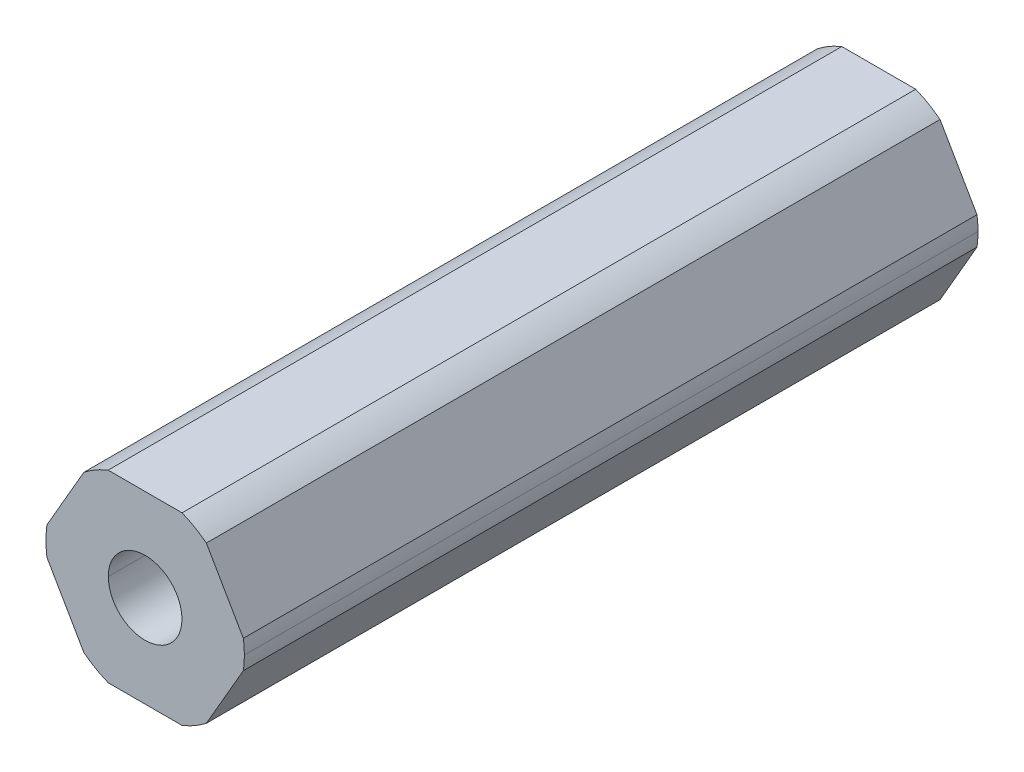
ISO-10303-21;
HEADER;
FILE_DESCRIPTION(('STEP AP214'),'2;1');
FILE_NAME('part.step','',(''),(''),'','','');
FILE_SCHEMA(('AUTOMOTIVE_DESIGN { 1 0 10303 214 1 1 1 1 }'));
ENDSEC;
DATA;
#1=APPLICATION_CONTEXT('core data for automotive mechanical design processes');
#2=APPLICATION_PROTOCOL_DEFINITION('international standard','automotive_design',2000,#1);
#3=PRODUCT_CONTEXT('',#1,'mechanical');
#4=PRODUCT('Part','Part','',(#3));
#5=PRODUCT_RELATED_PRODUCT_CATEGORY('part','',(#4));
#6=PRODUCT_DEFINITION_FORMATION('','',#4);
#7=PRODUCT_DEFINITION_CONTEXT('part definition',#1,'design');
#8=PRODUCT_DEFINITION('design','',#6,#7);
#9=PRODUCT_DEFINITION_SHAPE('','',#8);
#10=(LENGTH_UNIT() NAMED_UNIT(*) SI_UNIT(.MILLI.,.METRE.));
#11=(NAMED_UNIT(*) PLANE_ANGLE_UNIT() SI_UNIT($,.RADIAN.));
#12=(NAMED_UNIT(*) SI_UNIT($,.STERADIAN.) SOLID_ANGLE_UNIT());
#13=UNCERTAINTY_MEASURE_WITH_UNIT(LENGTH_MEASURE(1.E-05),#10,'distance_accuracy_value','');
#14=(GEOMETRIC_REPRESENTATION_CONTEXT(3) GLOBAL_UNCERTAINTY_ASSIGNED_CONTEXT((#13)) GLOBAL_UNIT_ASSIGNED_CONTEXT((#10,
#11,#12)) REPRESENTATION_CONTEXT('',''));
#15=CARTESIAN_POINT('',(0.,0.,0.));
#16=DIRECTION('',(0.,0.,1.));
#17=DIRECTION('',(1.,0.,0.));
#18=AXIS2_PLACEMENT_3D('',#15,#16,#17);
#19=CARTESIAN_POINT('',(0.,0.,-457.2));
#20=DIRECTION('',(0.,0.,1.));
#21=DIRECTION('',(1.,0.,0.));
#22=AXIS2_PLACEMENT_3D('',#19,#20,#21);
#23=CYLINDRICAL_SURFACE('',#22,2.55);
#24=CARTESIAN_POINT('',(0.,0.,-406.4));
#25=DIRECTION('',(0.,0.,1.));
#26=DIRECTION('',(1.,0.,0.));
#27=AXIS2_PLACEMENT_3D('',#24,#25,#26);
#28=CIRCLE('',#27,2.55);
#29=CARTESIAN_POINT('',(-2.55,0.,-406.4));
#30=VERTEX_POINT('',#29);
#31=CARTESIAN_POINT('',(2.55,0.,-406.4));
#32=VERTEX_POINT('',#31);
#33=EDGE_CURVE('E63',#30,#32,#28,.F.);
#34=ORIENTED_EDGE('',*,*,#33,.F.);
#35=DIRECTION('',(0.,0.,1.));
#36=VECTOR('',#35,1.);
#37=CARTESIAN_POINT('',(-2.55,0.,-457.2));
#38=LINE('',#37,#36);
#39=CARTESIAN_POINT('',(-2.55,0.,-457.2));
#40=VERTEX_POINT('',#39);
#41=EDGE_CURVE('E167',#40,#30,#38,.T.);
#42=ORIENTED_EDGE('',*,*,#41,.F.);
#43=CARTESIAN_POINT('',(0.,0.,-457.2));
#44=DIRECTION('',(0.,0.,1.));
#45=DIRECTION('',(1.,0.,0.));
#46=AXIS2_PLACEMENT_3D('',#43,#44,#45);
#47=CIRCLE('',#46,2.55);
#48=CARTESIAN_POINT('',(2.55,0.,-457.2));
#49=VERTEX_POINT('',#48);
#50=EDGE_CURVE('E50',#49,#40,#47,.T.);
#51=ORIENTED_EDGE('',*,*,#50,.F.);
#52=DIRECTION('',(0.,0.,1.));
#53=VECTOR('',#52,1.);
#54=CARTESIAN_POINT('',(2.55,0.,-457.2));
#55=LINE('',#54,#53);
#56=EDGE_CURVE('E169',#49,#32,#55,.T.);
#57=ORIENTED_EDGE('',*,*,#56,.T.);
#58=EDGE_LOOP('',(#34,#42,#51,#57));
#59=FACE_BOUND('',#58,.T.);
#60=ADVANCED_FACE('F42',(#59),#23,.F.);
#61=CARTESIAN_POINT('',(0.,0.,-457.2));
#62=DIRECTION('',(0.,0.,1.));
#63=DIRECTION('',(1.,0.,0.));
#64=AXIS2_PLACEMENT_3D('',#61,#62,#63);
#65=CYLINDRICAL_SURFACE('',#64,6.87);
#66=DIRECTION('',(0.,0.,1.));
#67=VECTOR('',#66,1.);
#68=CARTESIAN_POINT('',(2.55952629210952,6.3754,-457.2));
#69=LINE('',#68,#67);
#70=CARTESIAN_POINT('',(2.55952629210952,6.3754,-457.2));
#71=VERTEX_POINT('',#70);
#72=CARTESIAN_POINT('',(2.55952629210953,6.3754,-406.4));
#73=VERTEX_POINT('',#72);
#74=EDGE_CURVE('E230',#71,#73,#69,.T.);
#75=ORIENTED_EDGE('',*,*,#74,.T.);
#76=CARTESIAN_POINT('',(0.,0.,-406.4));
#77=DIRECTION('',(0.,0.,1.));
#78=DIRECTION('',(1.,0.,0.));
#79=AXIS2_PLACEMENT_3D('',#76,#77,#78);
#80=CIRCLE('',#79,6.87);
#81=CARTESIAN_POINT('',(4.24149521323254,5.40431479062105,-406.4));
#82=VERTEX_POINT('',#81);
#83=EDGE_CURVE('E283',#73,#82,#80,.F.);
#84=ORIENTED_EDGE('',*,*,#83,.T.);
#85=DIRECTION('',(0.,0.,-1.));
#86=VECTOR('',#85,1.);
#87=CARTESIAN_POINT('',(4.24149521323254,5.40431479062105,-457.2));
#88=LINE('',#87,#86);
#89=CARTESIAN_POINT('',(4.24149521323254,5.40431479062105,-457.2));
#90=VERTEX_POINT('',#89);
#91=EDGE_CURVE('E246',#82,#90,#88,.T.);
#92=ORIENTED_EDGE('',*,*,#91,.T.);
#93=CARTESIAN_POINT('',(0.,0.,-457.2));
#94=DIRECTION('',(0.,0.,1.));
#95=DIRECTION('',(1.,0.,0.));
#96=AXIS2_PLACEMENT_3D('',#93,#94,#95);
#97=CIRCLE('',#96,6.87);
#98=EDGE_CURVE('E188',#90,#71,#97,.T.);
#99=ORIENTED_EDGE('',*,*,#98,.T.);
#100=EDGE_LOOP('',(#75,#84,#92,#99));
#101=FACE_BOUND('',#100,.T.);
#102=ADVANCED_FACE('F314',(#101),#65,.T.);
#103=CARTESIAN_POINT('',(0.,0.,-457.2));
#104=DIRECTION('',(0.,0.,1.));
#105=DIRECTION('',(1.,0.,0.));
#106=AXIS2_PLACEMENT_3D('',#103,#104,#105);
#107=CYLINDRICAL_SURFACE('',#106,6.87);
#108=DIRECTION('',(0.,0.,1.));
#109=VECTOR('',#108,1.);
#110=CARTESIAN_POINT('',(-4.24149521323255,5.40431479062105,-457.2));
#111=LINE('',#110,#109);
#112=CARTESIAN_POINT('',(-4.24149521323255,5.40431479062105,-457.2));
#113=VERTEX_POINT('',#112);
#114=CARTESIAN_POINT('',(-4.24149521323255,5.40431479062105,-406.4));
#115=VERTEX_POINT('',#114);
#116=EDGE_CURVE('E190',#113,#115,#111,.T.);
#117=ORIENTED_EDGE('',*,*,#116,.T.);
#118=CARTESIAN_POINT('',(0.,0.,-406.4));
#119=DIRECTION('',(0.,0.,1.));
#120=DIRECTION('',(1.,0.,0.));
#121=AXIS2_PLACEMENT_3D('',#118,#119,#120);
#122=CIRCLE('',#121,6.87);
#123=CARTESIAN_POINT('',(-2.55952629210953,6.3754,-406.4));
#124=VERTEX_POINT('',#123);
#125=EDGE_CURVE('E298',#115,#124,#122,.F.);
#126=ORIENTED_EDGE('',*,*,#125,.T.);
#127=DIRECTION('',(0.,0.,-1.));
#128=VECTOR('',#127,1.);
#129=CARTESIAN_POINT('',(-2.55952629210953,6.3754,-457.2));
#130=LINE('',#129,#128);
#131=CARTESIAN_POINT('',(-2.55952629210953,6.3754,-457.2));
#132=VERTEX_POINT('',#131);
#133=EDGE_CURVE('E193',#124,#132,#130,.T.);
#134=ORIENTED_EDGE('',*,*,#133,.T.);
#135=CARTESIAN_POINT('',(0.,0.,-457.2));
#136=DIRECTION('',(0.,0.,1.));
#137=DIRECTION('',(1.,0.,0.));
#138=AXIS2_PLACEMENT_3D('',#135,#136,#137);
#139=CIRCLE('',#138,6.87);
#140=EDGE_CURVE('E195',#132,#113,#139,.T.);
#141=ORIENTED_EDGE('',*,*,#140,.T.);
#142=EDGE_LOOP('',(#117,#126,#134,#141));
#143=FACE_BOUND('',#142,.T.);
#144=ADVANCED_FACE('F326',(#143),#107,.T.);
#145=CARTESIAN_POINT('',(0.,0.,-457.2));
#146=DIRECTION('',(0.,0.,1.));
#147=DIRECTION('',(1.,0.,0.));
#148=AXIS2_PLACEMENT_3D('',#145,#146,#147);
#149=CYLINDRICAL_SURFACE('',#148,6.87);
#150=DIRECTION('',(0.,0.,1.));
#151=VECTOR('',#150,1.);
#152=CARTESIAN_POINT('',(-6.80102150534208,-0.971085209378962,-457.2));
#153=LINE('',#152,#151);
#154=CARTESIAN_POINT('',(-6.80102150534208,-0.971085209378956,-457.2));
#155=VERTEX_POINT('',#154);
#156=CARTESIAN_POINT('',(-6.80102150534207,-0.971085209378956,-406.4));
#157=VERTEX_POINT('',#156);
#158=EDGE_CURVE('E199',#155,#157,#153,.T.);
#159=ORIENTED_EDGE('',*,*,#158,.T.);
#160=CARTESIAN_POINT('',(0.,0.,-406.4));
#161=DIRECTION('',(0.,0.,1.));
#162=DIRECTION('',(1.,0.,0.));
#163=AXIS2_PLACEMENT_3D('',#160,#161,#162);
#164=CIRCLE('',#163,6.87);
#165=CARTESIAN_POINT('',(-6.80102150534208,0.97108520937896,-406.4));
#166=VERTEX_POINT('',#165);
#167=EDGE_CURVE('E295',#157,#166,#164,.F.);
#168=ORIENTED_EDGE('',*,*,#167,.T.);
#169=DIRECTION('',(0.,0.,-1.));
#170=VECTOR('',#169,1.);
#171=CARTESIAN_POINT('',(-6.80102150534208,0.97108520937896,-457.2));
#172=LINE('',#171,#170);
#173=CARTESIAN_POINT('',(-6.80102150534208,0.97108520937896,-457.2));
#174=VERTEX_POINT('',#173);
#175=EDGE_CURVE('E204',#166,#174,#172,.T.);
#176=ORIENTED_EDGE('',*,*,#175,.T.);
#177=CARTESIAN_POINT('',(0.,0.,-457.2));
#178=DIRECTION('',(0.,0.,1.));
#179=DIRECTION('',(1.,0.,0.));
#180=AXIS2_PLACEMENT_3D('',#177,#178,#179);
#181=CIRCLE('',#180,6.87);
#182=EDGE_CURVE('E198',#174,#155,#181,.T.);
#183=ORIENTED_EDGE('',*,*,#182,.T.);
#184=EDGE_LOOP('',(#159,#168,#176,#183));
#185=FACE_BOUND('',#184,.T.);
#186=ADVANCED_FACE('F333',(#185),#149,.T.);
#187=CARTESIAN_POINT('',(0.,0.,-457.2));
#188=DIRECTION('',(0.,0.,1.));
#189=DIRECTION('',(1.,0.,0.));
#190=AXIS2_PLACEMENT_3D('',#187,#188,#189);
#191=CYLINDRICAL_SURFACE('',#190,6.87);
#192=DIRECTION('',(0.,0.,1.));
#193=VECTOR('',#192,1.);
#194=CARTESIAN_POINT('',(-2.55952629210953,-6.3754,-457.2));
#195=LINE('',#194,#193);
#196=CARTESIAN_POINT('',(-2.55952629210953,-6.3754,-457.2));
#197=VERTEX_POINT('',#196);
#198=CARTESIAN_POINT('',(-2.55952629210953,-6.3754,-406.4));
#199=VERTEX_POINT('',#198);
#200=EDGE_CURVE('E212',#197,#199,#195,.T.);
#201=ORIENTED_EDGE('',*,*,#200,.T.);
#202=CARTESIAN_POINT('',(0.,0.,-406.4));
#203=DIRECTION('',(0.,0.,1.));
#204=DIRECTION('',(1.,0.,0.));
#205=AXIS2_PLACEMENT_3D('',#202,#203,#204);
#206=CIRCLE('',#205,6.87);
#207=CARTESIAN_POINT('',(-4.24149521323254,-5.40431479062105,-406.4));
#208=VERTEX_POINT('',#207);
#209=EDGE_CURVE('E271',#199,#208,#206,.F.);
#210=ORIENTED_EDGE('',*,*,#209,.T.);
#211=DIRECTION('',(0.,0.,-1.));
#212=VECTOR('',#211,1.);
#213=CARTESIAN_POINT('',(-4.24149521323255,-5.40431479062104,-457.2));
#214=LINE('',#213,#212);
#215=CARTESIAN_POINT('',(-4.24149521323254,-5.40431479062105,-457.2));
#216=VERTEX_POINT('',#215);
#217=EDGE_CURVE('E210',#208,#216,#214,.T.);
#218=ORIENTED_EDGE('',*,*,#217,.T.);
#219=CARTESIAN_POINT('',(0.,0.,-457.2));
#220=DIRECTION('',(0.,0.,1.));
#221=DIRECTION('',(1.,0.,0.));
#222=AXIS2_PLACEMENT_3D('',#219,#220,#221);
#223=CIRCLE('',#222,6.87);
#224=EDGE_CURVE('E241',#216,#197,#223,.T.);
#225=ORIENTED_EDGE('',*,*,#224,.T.);
#226=EDGE_LOOP('',(#201,#210,#218,#225));
#227=FACE_BOUND('',#226,.T.);
#228=ADVANCED_FACE('F270',(#227),#191,.T.);
#229=CARTESIAN_POINT('',(0.,0.,-457.2));
#230=DIRECTION('',(0.,0.,1.));
#231=DIRECTION('',(1.,0.,0.));
#232=AXIS2_PLACEMENT_3D('',#229,#230,#231);
#233=CYLINDRICAL_SURFACE('',#232,6.87);
#234=DIRECTION('',(0.,0.,1.));
#235=VECTOR('',#234,1.);
#236=CARTESIAN_POINT('',(4.24149521323255,-5.40431479062104,-457.2));
#237=LINE('',#236,#235);
#238=CARTESIAN_POINT('',(4.24149521323254,-5.40431479062105,-457.2));
#239=VERTEX_POINT('',#238);
#240=CARTESIAN_POINT('',(4.24149521323254,-5.40431479062105,-406.4));
#241=VERTEX_POINT('',#240);
#242=EDGE_CURVE('E217',#239,#241,#237,.T.);
#243=ORIENTED_EDGE('',*,*,#242,.T.);
#244=CARTESIAN_POINT('',(0.,0.,-406.4));
#245=DIRECTION('',(0.,0.,1.));
#246=DIRECTION('',(1.,0.,0.));
#247=AXIS2_PLACEMENT_3D('',#244,#245,#246);
#248=CIRCLE('',#247,6.87);
#249=CARTESIAN_POINT('',(2.55952629210953,-6.3754,-406.4));
#250=VERTEX_POINT('',#249);
#251=EDGE_CURVE('E285',#241,#250,#248,.F.);
#252=ORIENTED_EDGE('',*,*,#251,.T.);
#253=DIRECTION('',(0.,0.,-1.));
#254=VECTOR('',#253,1.);
#255=CARTESIAN_POINT('',(2.55952629210953,-6.3754,-457.2));
#256=LINE('',#255,#254);
#257=CARTESIAN_POINT('',(2.55952629210953,-6.3754,-457.2));
#258=VERTEX_POINT('',#257);
#259=EDGE_CURVE('E224',#250,#258,#256,.T.);
#260=ORIENTED_EDGE('',*,*,#259,.T.);
#261=CARTESIAN_POINT('',(0.,0.,-457.2));
#262=DIRECTION('',(0.,0.,1.));
#263=DIRECTION('',(1.,0.,0.));
#264=AXIS2_PLACEMENT_3D('',#261,#262,#263);
#265=CIRCLE('',#264,6.87);
#266=EDGE_CURVE('E254',#258,#239,#265,.T.);
#267=ORIENTED_EDGE('',*,*,#266,.T.);
#268=EDGE_LOOP('',(#243,#252,#260,#267));
#269=FACE_BOUND('',#268,.T.);
#270=ADVANCED_FACE('F344',(#269),#233,.T.);
#271=CARTESIAN_POINT('',(0.,0.,-457.2));
#272=DIRECTION('',(0.,0.,1.));
#273=DIRECTION('',(1.,0.,0.));
#274=AXIS2_PLACEMENT_3D('',#271,#272,#273);
#275=CYLINDRICAL_SURFACE('',#274,6.87);
#276=DIRECTION('',(0.,0.,1.));
#277=VECTOR('',#276,1.);
#278=CARTESIAN_POINT('',(6.80102150534208,0.971085209378949,-457.2));
#279=LINE('',#278,#277);
#280=CARTESIAN_POINT('',(6.80102150534208,0.97108520937895,-457.2));
#281=VERTEX_POINT('',#280);
#282=CARTESIAN_POINT('',(6.80102150534208,0.97108520937895,-406.4));
#283=VERTEX_POINT('',#282);
#284=EDGE_CURVE('E245',#281,#283,#279,.T.);
#285=ORIENTED_EDGE('',*,*,#284,.T.);
#286=CARTESIAN_POINT('',(0.,0.,-406.4));
#287=DIRECTION('',(0.,0.,1.));
#288=DIRECTION('',(1.,0.,0.));
#289=AXIS2_PLACEMENT_3D('',#286,#287,#288);
#290=CIRCLE('',#289,6.87);
#291=CARTESIAN_POINT('',(6.87,0.,-406.4));
#292=VERTEX_POINT('',#291);
#293=EDGE_CURVE('E345',#283,#292,#290,.F.);
#294=ORIENTED_EDGE('',*,*,#293,.T.);
#295=DIRECTION('',(0.,0.,1.));
#296=VECTOR('',#295,1.);
#297=CARTESIAN_POINT('',(6.87,0.,-457.2));
#298=LINE('',#297,#296);
#299=CARTESIAN_POINT('',(6.87,0.,-457.2));
#300=VERTEX_POINT('',#299);
#301=EDGE_CURVE('E205',#300,#292,#298,.T.);
#302=ORIENTED_EDGE('',*,*,#301,.F.);
#303=CARTESIAN_POINT('',(0.,0.,-457.2));
#304=DIRECTION('',(0.,0.,1.));
#305=DIRECTION('',(1.,0.,0.));
#306=AXIS2_PLACEMENT_3D('',#303,#304,#305);
#307=CIRCLE('',#306,6.87);
#308=EDGE_CURVE('E260',#300,#281,#307,.T.);
#309=ORIENTED_EDGE('',*,*,#308,.T.);
#310=EDGE_LOOP('',(#285,#294,#302,#309));
#311=FACE_BOUND('',#310,.T.);
#312=ADVANCED_FACE('F356',(#311),#275,.T.);
#313=CARTESIAN_POINT('',(-3.68083890619154,-6.3754,457.2));
#314=DIRECTION('',(0.,1.,0.));
#315=DIRECTION('',(1.,0.,0.));
#316=AXIS2_PLACEMENT_3D('',#313,#314,#315);
#317=PLANE('',#316);
#318=DIRECTION('',(1.,0.,0.));
#319=VECTOR('',#318,1.);
#320=CARTESIAN_POINT('',(-3.68083890619154,-6.3754,-406.4));
#321=LINE('',#320,#319);
#322=EDGE_CURVE('E279',#199,#250,#321,.T.);
#323=ORIENTED_EDGE('',*,*,#322,.F.);
#324=ORIENTED_EDGE('',*,*,#200,.F.);
#325=DIRECTION('',(1.,0.,0.));
#326=VECTOR('',#325,1.);
#327=CARTESIAN_POINT('',(-3.68083890619154,-6.3754,-457.2));
#328=LINE('',#327,#326);
#329=EDGE_CURVE('E220',#197,#258,#328,.T.);
#330=ORIENTED_EDGE('',*,*,#329,.T.);
#331=ORIENTED_EDGE('',*,*,#259,.F.);
#332=EDGE_LOOP('',(#323,#324,#330,#331));
#333=FACE_BOUND('',#332,.T.);
#334=ADVANCED_FACE('F277',(#333),#317,.F.);
#335=CARTESIAN_POINT('',(-7.36167781238308,0.,457.2));
#336=DIRECTION('',(0.866025403784439,0.5,0.));
#337=DIRECTION('',(0.,0.,-1.));
#338=AXIS2_PLACEMENT_3D('',#335,#336,#337);
#339=PLANE('',#338);
#340=DIRECTION('',(0.5,-0.866025403784439,0.));
#341=VECTOR('',#340,1.);
#342=CARTESIAN_POINT('',(-7.36167781238308,0.,-406.4));
#343=LINE('',#342,#341);
#344=EDGE_CURVE('E293',#157,#208,#343,.T.);
#345=ORIENTED_EDGE('',*,*,#344,.F.);
#346=ORIENTED_EDGE('',*,*,#158,.F.);
#347=DIRECTION('',(0.5,-0.866025403784439,0.));
#348=VECTOR('',#347,1.);
#349=CARTESIAN_POINT('',(-7.36167781238308,0.,-457.2));
#350=LINE('',#349,#348);
#351=EDGE_CURVE('E203',#155,#216,#350,.T.);
#352=ORIENTED_EDGE('',*,*,#351,.T.);
#353=ORIENTED_EDGE('',*,*,#217,.F.);
#354=EDGE_LOOP('',(#345,#346,#352,#353));
#355=FACE_BOUND('',#354,.T.);
#356=ADVANCED_FACE('F338',(#355),#339,.F.);
#357=CARTESIAN_POINT('',(-3.68083890619154,6.3754,457.2));
#358=DIRECTION('',(0.866025403784439,-0.5,0.));
#359=DIRECTION('',(0.,0.,-1.));
#360=AXIS2_PLACEMENT_3D('',#357,#358,#359);
#361=PLANE('',#360);
#362=DIRECTION('',(-0.5,-0.866025403784439,0.));
#363=VECTOR('',#362,1.);
#364=CARTESIAN_POINT('',(-3.68083890619154,6.3754,-406.4));
#365=LINE('',#364,#363);
#366=EDGE_CURVE('E184',#115,#166,#365,.T.);
#367=ORIENTED_EDGE('',*,*,#366,.F.);
#368=ORIENTED_EDGE('',*,*,#116,.F.);
#369=DIRECTION('',(-0.5,-0.866025403784439,0.));
#370=VECTOR('',#369,1.);
#371=CARTESIAN_POINT('',(-3.68083890619154,6.3754,-457.2));
#372=LINE('',#371,#370);
#373=EDGE_CURVE('E192',#113,#174,#372,.T.);
#374=ORIENTED_EDGE('',*,*,#373,.T.);
#375=ORIENTED_EDGE('',*,*,#175,.F.);
#376=EDGE_LOOP('',(#367,#368,#374,#375));
#377=FACE_BOUND('',#376,.T.);
#378=ADVANCED_FACE('F329',(#377),#361,.F.);
#379=CARTESIAN_POINT('',(3.68083890619154,6.3754,457.2));
#380=DIRECTION('',(0.,-1.,0.));
#381=DIRECTION('',(0.,0.,-1.));
#382=AXIS2_PLACEMENT_3D('',#379,#380,#381);
#383=PLANE('',#382);
#384=DIRECTION('',(-1.,0.,0.));
#385=VECTOR('',#384,1.);
#386=CARTESIAN_POINT('',(3.68083890619154,6.3754,-406.4));
#387=LINE('',#386,#385);
#388=EDGE_CURVE('E291',#73,#124,#387,.T.);
#389=ORIENTED_EDGE('',*,*,#388,.F.);
#390=ORIENTED_EDGE('',*,*,#74,.F.);
#391=DIRECTION('',(-1.,0.,0.));
#392=VECTOR('',#391,1.);
#393=CARTESIAN_POINT('',(3.68083890619154,6.3754,-457.2));
#394=LINE('',#393,#392);
#395=EDGE_CURVE('E226',#71,#132,#394,.T.);
#396=ORIENTED_EDGE('',*,*,#395,.T.);
#397=ORIENTED_EDGE('',*,*,#133,.F.);
#398=EDGE_LOOP('',(#389,#390,#396,#397));
#399=FACE_BOUND('',#398,.T.);
#400=ADVANCED_FACE('F323',(#399),#383,.F.);
#401=CARTESIAN_POINT('',(7.36167781238308,0.,457.2));
#402=DIRECTION('',(-0.866025403784439,-0.5,0.));
#403=DIRECTION('',(-0.5,0.866025403784439,0.));
#404=AXIS2_PLACEMENT_3D('',#401,#402,#403);
#405=PLANE('',#404);
#406=DIRECTION('',(-0.5,0.866025403784439,0.));
#407=VECTOR('',#406,1.);
#408=CARTESIAN_POINT('',(7.36167781238308,0.,-406.4));
#409=LINE('',#408,#407);
#410=EDGE_CURVE('E281',#283,#82,#409,.T.);
#411=ORIENTED_EDGE('',*,*,#410,.F.);
#412=ORIENTED_EDGE('',*,*,#284,.F.);
#413=DIRECTION('',(-0.5,0.866025403784439,0.));
#414=VECTOR('',#413,1.);
#415=CARTESIAN_POINT('',(7.36167781238308,0.,-457.2));
#416=LINE('',#415,#414);
#417=EDGE_CURVE('E248',#281,#90,#416,.T.);
#418=ORIENTED_EDGE('',*,*,#417,.T.);
#419=ORIENTED_EDGE('',*,*,#91,.F.);
#420=EDGE_LOOP('',(#411,#412,#418,#419));
#421=FACE_BOUND('',#420,.T.);
#422=ADVANCED_FACE('F359',(#421),#405,.F.);
#423=CARTESIAN_POINT('',(3.68083890619154,-6.3754,457.2));
#424=DIRECTION('',(-0.866025403784439,0.5,0.));
#425=DIRECTION('',(0.,0.,1.));
#426=AXIS2_PLACEMENT_3D('',#423,#424,#425);
#427=PLANE('',#426);
#428=DIRECTION('',(0.5,0.866025403784439,0.));
#429=VECTOR('',#428,1.);
#430=CARTESIAN_POINT('',(3.68083890619154,-6.3754,-406.4));
#431=LINE('',#430,#429);
#432=CARTESIAN_POINT('',(6.80102150534208,-0.971085209378962,-406.4));
#433=VERTEX_POINT('',#432);
#434=EDGE_CURVE('E57',#241,#433,#431,.T.);
#435=ORIENTED_EDGE('',*,*,#434,.F.);
#436=ORIENTED_EDGE('',*,*,#242,.F.);
#437=DIRECTION('',(0.5,0.866025403784439,0.));
#438=VECTOR('',#437,1.);
#439=CARTESIAN_POINT('',(3.68083890619154,-6.3754,-457.2));
#440=LINE('',#439,#438);
#441=CARTESIAN_POINT('',(6.80102150534208,-0.971085209378955,-457.2));
#442=VERTEX_POINT('',#441);
#443=EDGE_CURVE('E234',#239,#442,#440,.T.);
#444=ORIENTED_EDGE('',*,*,#443,.T.);
#445=DIRECTION('',(0.,0.,-1.));
#446=VECTOR('',#445,1.);
#447=CARTESIAN_POINT('',(6.80102150534208,-0.971085209378962,-457.2));
#448=LINE('',#447,#446);
#449=EDGE_CURVE('E209',#433,#442,#448,.T.);
#450=ORIENTED_EDGE('',*,*,#449,.F.);
#451=EDGE_LOOP('',(#435,#436,#444,#450));
#452=FACE_BOUND('',#451,.T.);
#453=ADVANCED_FACE('F354',(#452),#427,.F.);
#454=CARTESIAN_POINT('',(0.,0.,-457.2));
#455=DIRECTION('',(0.,0.,1.));
#456=DIRECTION('',(1.,0.,0.));
#457=AXIS2_PLACEMENT_3D('',#454,#455,#456);
#458=CYLINDRICAL_SURFACE('',#457,6.87);
#459=ORIENTED_EDGE('',*,*,#301,.T.);
#460=CARTESIAN_POINT('',(0.,0.,-406.4));
#461=DIRECTION('',(0.,0.,1.));
#462=DIRECTION('',(1.,0.,0.));
#463=AXIS2_PLACEMENT_3D('',#460,#461,#462);
#464=CIRCLE('',#463,6.87);
#465=EDGE_CURVE('E170',#292,#433,#464,.F.);
#466=ORIENTED_EDGE('',*,*,#465,.T.);
#467=ORIENTED_EDGE('',*,*,#449,.T.);
#468=CARTESIAN_POINT('',(0.,0.,-457.2));
#469=DIRECTION('',(0.,0.,1.));
#470=DIRECTION('',(1.,0.,0.));
#471=AXIS2_PLACEMENT_3D('',#468,#469,#470);
#472=CIRCLE('',#471,6.87);
#473=EDGE_CURVE('E181',#442,#300,#472,.T.);
#474=ORIENTED_EDGE('',*,*,#473,.T.);
#475=EDGE_LOOP('',(#459,#466,#467,#474));
#476=FACE_BOUND('',#475,.T.);
#477=ADVANCED_FACE('F352',(#476),#458,.T.);
#478=CARTESIAN_POINT('',(0.,0.,-457.2));
#479=DIRECTION('',(0.,0.,1.));
#480=DIRECTION('',(1.,0.,0.));
#481=AXIS2_PLACEMENT_3D('',#478,#479,#480);
#482=CYLINDRICAL_SURFACE('',#481,2.55);
#483=CARTESIAN_POINT('',(0.,0.,-406.4));
#484=DIRECTION('',(0.,0.,1.));
#485=DIRECTION('',(1.,0.,0.));
#486=AXIS2_PLACEMENT_3D('',#483,#484,#485);
#487=CIRCLE('',#486,2.55);
#488=EDGE_CURVE('E11',#32,#30,#487,.F.);
#489=ORIENTED_EDGE('',*,*,#488,.F.);
#490=ORIENTED_EDGE('',*,*,#56,.F.);
#491=CARTESIAN_POINT('',(0.,0.,-457.2));
#492=DIRECTION('',(0.,0.,1.));
#493=DIRECTION('',(1.,0.,0.));
#494=AXIS2_PLACEMENT_3D('',#491,#492,#493);
#495=CIRCLE('',#494,2.55);
#496=EDGE_CURVE('E174',#40,#49,#495,.T.);
#497=ORIENTED_EDGE('',*,*,#496,.F.);
#498=ORIENTED_EDGE('',*,*,#41,.T.);
#499=EDGE_LOOP('',(#489,#490,#497,#498));
#500=FACE_BOUND('',#499,.T.);
#501=ADVANCED_FACE('F172',(#500),#482,.F.);
#502=CARTESIAN_POINT('',(0.,0.,-457.2));
#503=DIRECTION('',(0.,0.,1.));
#504=DIRECTION('',(1.,0.,0.));
#505=AXIS2_PLACEMENT_3D('',#502,#503,#504);
#506=PLANE('',#505);
#507=ORIENTED_EDGE('',*,*,#50,.T.);
#508=ORIENTED_EDGE('',*,*,#496,.T.);
#509=EDGE_LOOP('',(#507,#508));
#510=FACE_BOUND('',#509,.T.);
#511=ORIENTED_EDGE('',*,*,#98,.F.);
#512=ORIENTED_EDGE('',*,*,#417,.F.);
#513=ORIENTED_EDGE('',*,*,#308,.F.);
#514=ORIENTED_EDGE('',*,*,#473,.F.);
#515=ORIENTED_EDGE('',*,*,#443,.F.);
#516=ORIENTED_EDGE('',*,*,#266,.F.);
#517=ORIENTED_EDGE('',*,*,#329,.F.);
#518=ORIENTED_EDGE('',*,*,#224,.F.);
#519=ORIENTED_EDGE('',*,*,#351,.F.);
#520=ORIENTED_EDGE('',*,*,#182,.F.);
#521=ORIENTED_EDGE('',*,*,#373,.F.);
#522=ORIENTED_EDGE('',*,*,#140,.F.);
#523=ORIENTED_EDGE('',*,*,#395,.F.);
#524=EDGE_LOOP('',(#511,#512,#513,#514,#515,#516,#517,#518,#519,#520,#521,#522,#523));
#525=FACE_BOUND('',#524,.T.);
#526=ADVANCED_FACE('F44',(#510,#525),#506,.F.);
#527=CARTESIAN_POINT('',(0.,0.,-406.4));
#528=DIRECTION('',(0.,0.,1.));
#529=DIRECTION('',(1.,0.,0.));
#530=AXIS2_PLACEMENT_3D('',#527,#528,#529);
#531=PLANE('',#530);
#532=ORIENTED_EDGE('',*,*,#33,.T.);
#533=ORIENTED_EDGE('',*,*,#488,.T.);
#534=EDGE_LOOP('',(#532,#533));
#535=FACE_BOUND('',#534,.T.);
#536=ORIENTED_EDGE('',*,*,#366,.T.);
#537=ORIENTED_EDGE('',*,*,#167,.F.);
#538=ORIENTED_EDGE('',*,*,#344,.T.);
#539=ORIENTED_EDGE('',*,*,#209,.F.);
#540=ORIENTED_EDGE('',*,*,#322,.T.);
#541=ORIENTED_EDGE('',*,*,#251,.F.);
#542=ORIENTED_EDGE('',*,*,#434,.T.);
#543=ORIENTED_EDGE('',*,*,#465,.F.);
#544=ORIENTED_EDGE('',*,*,#293,.F.);
#545=ORIENTED_EDGE('',*,*,#410,.T.);
#546=ORIENTED_EDGE('',*,*,#83,.F.);
#547=ORIENTED_EDGE('',*,*,#388,.T.);
#548=ORIENTED_EDGE('',*,*,#125,.F.);
#549=EDGE_LOOP('',(#536,#537,#538,#539,#540,#541,#542,#543,#544,#545,#546,#547,#548));
#550=FACE_BOUND('',#549,.T.);
#551=ADVANCED_FACE('F160',(#535,#550),#531,.T.);
#552=CLOSED_SHELL('',(#60,#102,#144,#186,#228,#270,#312,#334,#356,#378,#400,#422,#453,#477,#501,
#526,#551));
#553=MANIFOLD_SOLID_BREP('B2',#552);
#554=ADVANCED_BREP_SHAPE_REPRESENTATION('',(#18,#553),#14);
#555=SHAPE_DEFINITION_REPRESENTATION(#9,#554);
ENDSEC;
END-ISO-10303-21;
